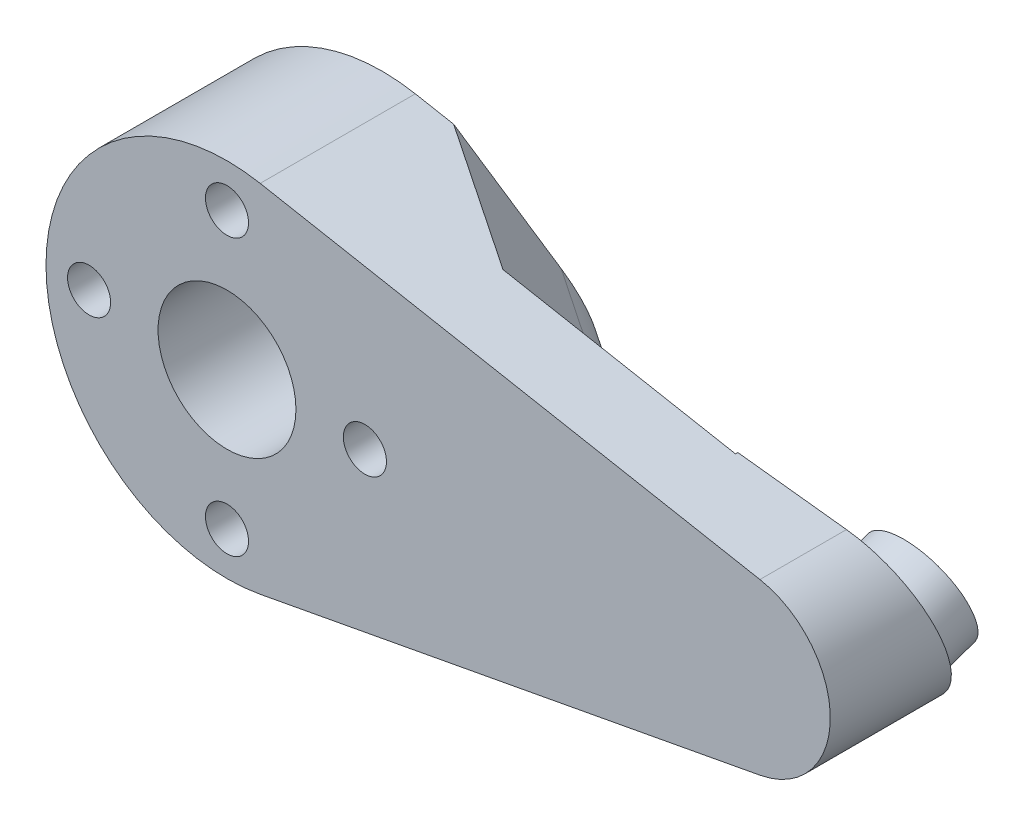
ISO-10303-21;
HEADER;
FILE_DESCRIPTION(('STEP AP214'),'2;1');
FILE_NAME('part.step','',(''),(''),'','','');
FILE_SCHEMA(('AUTOMOTIVE_DESIGN { 1 0 10303 214 1 1 1 1 }'));
ENDSEC;
DATA;
#1=APPLICATION_CONTEXT('core data for automotive mechanical design processes');
#2=APPLICATION_PROTOCOL_DEFINITION('international standard','automotive_design',2000,#1);
#3=PRODUCT_CONTEXT('',#1,'mechanical');
#4=PRODUCT('Part','Part','',(#3));
#5=PRODUCT_RELATED_PRODUCT_CATEGORY('part','',(#4));
#6=PRODUCT_DEFINITION_FORMATION('','',#4);
#7=PRODUCT_DEFINITION_CONTEXT('part definition',#1,'design');
#8=PRODUCT_DEFINITION('design','',#6,#7);
#9=PRODUCT_DEFINITION_SHAPE('','',#8);
#10=(LENGTH_UNIT() NAMED_UNIT(*) SI_UNIT(.MILLI.,.METRE.));
#11=(NAMED_UNIT(*) PLANE_ANGLE_UNIT() SI_UNIT($,.RADIAN.));
#12=(NAMED_UNIT(*) SI_UNIT($,.STERADIAN.) SOLID_ANGLE_UNIT());
#13=UNCERTAINTY_MEASURE_WITH_UNIT(LENGTH_MEASURE(1.E-05),#10,'distance_accuracy_value','');
#14=(GEOMETRIC_REPRESENTATION_CONTEXT(3) GLOBAL_UNCERTAINTY_ASSIGNED_CONTEXT((#13)) GLOBAL_UNIT_ASSIGNED_CONTEXT((#10,
#11,#12)) REPRESENTATION_CONTEXT('',''));
#15=CARTESIAN_POINT('',(0.,0.,0.));
#16=DIRECTION('',(0.,0.,1.));
#17=DIRECTION('',(1.,0.,0.));
#18=AXIS2_PLACEMENT_3D('',#15,#16,#17);
#19=CARTESIAN_POINT('',(30.9166666666667,-4.91525403435288,10.));
#20=DIRECTION('',(-0.183333333333333,0.983050806870575,0.));
#21=DIRECTION('',(-0.983050806870575,-0.183333333333333,0.));
#22=AXIS2_PLACEMENT_3D('',#19,#20,#21);
#23=PLANE('',#22);
#24=DIRECTION('',(-0.983050806870575,-0.183333333333333,0.));
#25=VECTOR('',#24,1.);
#26=CARTESIAN_POINT('',(30.9166666666667,-4.91525403435288,0.999999999999999));
#27=LINE('',#26,#25);
#28=CARTESIAN_POINT('',(5.0005796275775,-9.74845552366161,1.));
#29=VERTEX_POINT('',#28);
#30=CARTESIAN_POINT('',(1.925,-10.322033472141,0.999999999999999));
#31=VERTEX_POINT('',#30);
#32=EDGE_CURVE('E280',#29,#31,#27,.T.);
#33=ORIENTED_EDGE('',*,*,#32,.F.);
#34=DIRECTION('',(0.84267893969236,0.157154785758636,0.514970463145331));
#35=VECTOR('',#34,1.);
#36=CARTESIAN_POINT('',(17.9750314827619,-7.32879471858486,8.92883168927933));
#37=LINE('',#36,#35);
#38=CARTESIAN_POINT('',(12.3642159912139,-8.37517960489443,5.5));
#39=VERTEX_POINT('',#38);
#40=EDGE_CURVE('E145',#29,#39,#37,.T.);
#41=ORIENTED_EDGE('',*,*,#40,.T.);
#42=DIRECTION('',(-0.983050806870575,-0.183333333333333,0.));
#43=VECTOR('',#42,1.);
#44=CARTESIAN_POINT('',(19.3602247485707,-7.07046412472671,5.5));
#45=LINE('',#44,#43);
#46=CARTESIAN_POINT('',(29.7333333333333,-5.13593890936464,5.5));
#47=VERTEX_POINT('',#46);
#48=EDGE_CURVE('E232',#47,#39,#45,.T.);
#49=ORIENTED_EDGE('',*,*,#48,.F.);
#50=DIRECTION('',(0.,0.,1.));
#51=VECTOR('',#50,1.);
#52=CARTESIAN_POINT('',(29.7333333333333,-5.13593890936464,1.17631364869091));
#53=LINE('',#52,#51);
#54=CARTESIAN_POINT('',(29.7333333333333,-5.13593890936464,1.48337060694694));
#55=VERTEX_POINT('',#54);
#56=EDGE_CURVE('E177',#47,#55,#53,.F.);
#57=ORIENTED_EDGE('',*,*,#56,.T.);
#58=DIRECTION('',(-0.981057934819953,-0.182961674133835,-0.0636423940856517));
#59=VECTOR('',#58,1.);
#60=CARTESIAN_POINT('',(31.443625478253,-4.81697924043349,1.5943192908374));
#61=LINE('',#60,#59);
#62=CARTESIAN_POINT('',(30.6041422781402,-4.97353803910225,1.53986101803451));
#63=VERTEX_POINT('',#62);
#64=EDGE_CURVE('E240',#63,#55,#61,.T.);
#65=ORIENTED_EDGE('',*,*,#64,.F.);
#66=CARTESIAN_POINT('',(30.9166666666667,-4.91525403435287,1.56013484651094));
#67=VERTEX_POINT('',#66);
#68=EDGE_CURVE('E237',#67,#63,#61,.T.);
#69=ORIENTED_EDGE('',*,*,#68,.F.);
#70=DIRECTION('',(0.,0.,-1.));
#71=VECTOR('',#70,1.);
#72=CARTESIAN_POINT('',(30.9166666666667,-4.91525403435287,10.));
#73=LINE('',#72,#71);
#74=CARTESIAN_POINT('',(30.9166666666667,-4.91525403435287,10.));
#75=VERTEX_POINT('',#74);
#76=EDGE_CURVE('E194',#75,#67,#73,.T.);
#77=ORIENTED_EDGE('',*,*,#76,.F.);
#78=DIRECTION('',(0.983050806870575,0.183333333333333,0.));
#79=VECTOR('',#78,1.);
#80=CARTESIAN_POINT('',(30.9166666666667,-4.91525403435288,10.));
#81=LINE('',#80,#79);
#82=CARTESIAN_POINT('',(1.925,-10.322033472141,10.));
#83=VERTEX_POINT('',#82);
#84=EDGE_CURVE('E207',#83,#75,#81,.T.);
#85=ORIENTED_EDGE('',*,*,#84,.F.);
#86=DIRECTION('',(0.,0.,-1.));
#87=VECTOR('',#86,1.);
#88=CARTESIAN_POINT('',(1.925,-10.322033472141,10.));
#89=LINE('',#88,#87);
#90=EDGE_CURVE('E191',#83,#31,#89,.T.);
#91=ORIENTED_EDGE('',*,*,#90,.T.);
#92=EDGE_LOOP('',(#33,#41,#49,#57,#65,#69,#77,#85,#91));
#93=FACE_BOUND('',#92,.T.);
#94=ADVANCED_FACE('F40',(#93),#23,.F.);
#95=CARTESIAN_POINT('',(1.925,10.322033472141,10.));
#96=DIRECTION('',(-0.183333333333333,-0.983050806870575,0.));
#97=DIRECTION('',(0.983050806870575,-0.183333333333333,0.));
#98=AXIS2_PLACEMENT_3D('',#95,#96,#97);
#99=PLANE('',#98);
#100=DIRECTION('',(0.983050806870575,-0.183333333333333,0.));
#101=VECTOR('',#100,1.);
#102=CARTESIAN_POINT('',(1.925,10.322033472141,0.999999999999999));
#103=LINE('',#102,#101);
#104=CARTESIAN_POINT('',(1.925,10.322033472141,0.999999999999999));
#105=VERTEX_POINT('',#104);
#106=CARTESIAN_POINT('',(4.1504690040238,9.90699627580677,1.));
#107=VERTEX_POINT('',#106);
#108=EDGE_CURVE('E270',#105,#107,#103,.T.);
#109=ORIENTED_EDGE('',*,*,#108,.F.);
#110=DIRECTION('',(0.,0.,-1.));
#111=VECTOR('',#110,1.);
#112=CARTESIAN_POINT('',(1.925,10.322033472141,10.));
#113=LINE('',#112,#111);
#114=CARTESIAN_POINT('',(1.925,10.322033472141,10.));
#115=VERTEX_POINT('',#114);
#116=EDGE_CURVE('E200',#115,#105,#113,.T.);
#117=ORIENTED_EDGE('',*,*,#116,.F.);
#118=DIRECTION('',(-0.983050806870575,0.183333333333333,0.));
#119=VECTOR('',#118,1.);
#120=CARTESIAN_POINT('',(1.925,10.322033472141,10.));
#121=LINE('',#120,#119);
#122=CARTESIAN_POINT('',(30.9166666666667,4.91525403435287,10.));
#123=VERTEX_POINT('',#122);
#124=EDGE_CURVE('E203',#123,#115,#121,.T.);
#125=ORIENTED_EDGE('',*,*,#124,.F.);
#126=DIRECTION('',(0.,0.,-1.));
#127=VECTOR('',#126,1.);
#128=CARTESIAN_POINT('',(30.9166666666667,4.91525403435287,10.));
#129=LINE('',#128,#127);
#130=CARTESIAN_POINT('',(30.9166666666667,4.91525403435287,4.97963279072575));
#131=VERTEX_POINT('',#130);
#132=EDGE_CURVE('E197',#123,#131,#129,.T.);
#133=ORIENTED_EDGE('',*,*,#132,.T.);
#134=DIRECTION('',(0.981057934819953,-0.182961674133835,-0.0636423940856517));
#135=VECTOR('',#134,1.);
#136=CARTESIAN_POINT('',(1.72897047901362,10.3585918527079,6.8730733280247));
#137=LINE('',#136,#135);
#138=CARTESIAN_POINT('',(25.,6.01867840941168,5.36345398854578));
#139=VERTEX_POINT('',#138);
#140=EDGE_CURVE('E241',#139,#131,#137,.T.);
#141=ORIENTED_EDGE('',*,*,#140,.F.);
#142=DIRECTION('',(0.,0.,1.));
#143=VECTOR('',#142,1.);
#144=CARTESIAN_POINT('',(25.,6.01867840941168,5.5));
#145=LINE('',#144,#143);
#146=CARTESIAN_POINT('',(25.,6.01867840941168,5.5));
#147=VERTEX_POINT('',#146);
#148=EDGE_CURVE('E230',#139,#147,#145,.T.);
#149=ORIENTED_EDGE('',*,*,#148,.T.);
#150=DIRECTION('',(-0.983050806870575,0.183333333333333,0.));
#151=VECTOR('',#150,1.);
#152=CARTESIAN_POINT('',(19.3602247485707,7.0704641247267,5.5));
#153=LINE('',#152,#151);
#154=CARTESIAN_POINT('',(11.5141053676602,8.5337203570396,5.5));
#155=VERTEX_POINT('',#154);
#156=EDGE_CURVE('E227',#147,#155,#153,.T.);
#157=ORIENTED_EDGE('',*,*,#156,.T.);
#158=DIRECTION('',(-0.84267893969236,0.157154785758636,-0.514970463145331));
#159=VECTOR('',#158,1.);
#160=CARTESIAN_POINT('',(8.74958675476994,9.04928721159174,3.81057195878931));
#161=LINE('',#160,#159);
#162=EDGE_CURVE('E188',#155,#107,#161,.T.);
#163=ORIENTED_EDGE('',*,*,#162,.T.);
#164=EDGE_LOOP('',(#109,#117,#125,#133,#141,#149,#157,#163));
#165=FACE_BOUND('',#164,.T.);
#166=ADVANCED_FACE('F292',(#165),#99,.F.);
#167=CARTESIAN_POINT('',(0.,0.,10.));
#168=DIRECTION('',(0.,0.,-1.));
#169=DIRECTION('',(-1.,0.,0.));
#170=AXIS2_PLACEMENT_3D('',#167,#168,#169);
#171=CYLINDRICAL_SURFACE('',#170,10.5);
#172=CARTESIAN_POINT('',(0.,0.,0.999999999999999));
#173=DIRECTION('',(0.,0.,-1.));
#174=DIRECTION('',(-1.,0.,0.));
#175=AXIS2_PLACEMENT_3D('',#172,#173,#174);
#176=CIRCLE('',#175,10.5);
#177=EDGE_CURVE('E272',#31,#105,#176,.T.);
#178=ORIENTED_EDGE('',*,*,#177,.F.);
#179=ORIENTED_EDGE('',*,*,#90,.F.);
#180=CARTESIAN_POINT('',(0.,0.,10.));
#181=DIRECTION('',(0.,0.,1.));
#182=DIRECTION('',(1.,0.,0.));
#183=AXIS2_PLACEMENT_3D('',#180,#181,#182);
#184=CIRCLE('',#183,10.5);
#185=EDGE_CURVE('E209',#115,#83,#184,.T.);
#186=ORIENTED_EDGE('',*,*,#185,.F.);
#187=ORIENTED_EDGE('',*,*,#116,.T.);
#188=EDGE_LOOP('',(#178,#179,#186,#187));
#189=FACE_BOUND('',#188,.T.);
#190=ADVANCED_FACE('F311',(#189),#171,.T.);
#191=CARTESIAN_POINT('',(0.,0.,-0.000999999999999265));
#192=DIRECTION('',(0.,0.,1.));
#193=DIRECTION('',(1.,0.,0.));
#194=AXIS2_PLACEMENT_3D('',#191,#192,#193);
#195=CYLINDRICAL_SURFACE('',#194,4.);
#196=CARTESIAN_POINT('',(0.,0.,10.));
#197=DIRECTION('',(0.,0.,1.));
#198=DIRECTION('',(1.,0.,0.));
#199=AXIS2_PLACEMENT_3D('',#196,#197,#198);
#200=CIRCLE('',#199,4.);
#201=CARTESIAN_POINT('',(4.,0.,10.));
#202=VERTEX_POINT('',#201);
#203=EDGE_CURVE('E212',#202,#202,#200,.T.);
#204=ORIENTED_EDGE('',*,*,#203,.T.);
#205=EDGE_LOOP('',(#204));
#206=FACE_BOUND('',#205,.T.);
#207=CARTESIAN_POINT('',(0.,0.,1.));
#208=DIRECTION('',(0.,0.,-1.));
#209=DIRECTION('',(-1.,0.,0.));
#210=AXIS2_PLACEMENT_3D('',#207,#208,#209);
#211=CIRCLE('',#210,4.);
#212=CARTESIAN_POINT('',(-4.,0.,1.));
#213=VERTEX_POINT('',#212);
#214=EDGE_CURVE('E255',#213,#213,#211,.F.);
#215=ORIENTED_EDGE('',*,*,#214,.F.);
#216=EDGE_LOOP('',(#215));
#217=FACE_BOUND('',#216,.T.);
#218=ADVANCED_FACE('F354',(#206,#217),#195,.F.);
#219=CARTESIAN_POINT('',(-8.,0.,-0.000999999999999265));
#220=DIRECTION('',(0.,0.,1.));
#221=DIRECTION('',(1.,0.,0.));
#222=AXIS2_PLACEMENT_3D('',#219,#220,#221);
#223=CYLINDRICAL_SURFACE('',#222,1.25000000000008);
#224=CARTESIAN_POINT('',(-8.,0.,10.));
#225=DIRECTION('',(0.,0.,1.));
#226=DIRECTION('',(1.,0.,0.));
#227=AXIS2_PLACEMENT_3D('',#224,#225,#226);
#228=CIRCLE('',#227,1.25000000000008);
#229=CARTESIAN_POINT('',(-6.74999999999992,0.,10.));
#230=VERTEX_POINT('',#229);
#231=EDGE_CURVE('E172',#230,#230,#228,.T.);
#232=ORIENTED_EDGE('',*,*,#231,.T.);
#233=EDGE_LOOP('',(#232));
#234=FACE_BOUND('',#233,.T.);
#235=CARTESIAN_POINT('',(-8.,0.,1.));
#236=DIRECTION('',(0.,0.,-1.));
#237=DIRECTION('',(-1.,0.,0.));
#238=AXIS2_PLACEMENT_3D('',#235,#236,#237);
#239=CIRCLE('',#238,1.25000000000008);
#240=CARTESIAN_POINT('',(-9.25000000000008,0.,1.));
#241=VERTEX_POINT('',#240);
#242=EDGE_CURVE('E258',#241,#241,#239,.F.);
#243=ORIENTED_EDGE('',*,*,#242,.F.);
#244=EDGE_LOOP('',(#243));
#245=FACE_BOUND('',#244,.T.);
#246=ADVANCED_FACE('F391',(#234,#245),#223,.F.);
#247=CARTESIAN_POINT('',(0.,-8.,-0.000999999999999265));
#248=DIRECTION('',(0.,0.,1.));
#249=DIRECTION('',(1.,0.,0.));
#250=AXIS2_PLACEMENT_3D('',#247,#248,#249);
#251=CYLINDRICAL_SURFACE('',#250,1.25000000000005);
#252=CARTESIAN_POINT('',(0.,-8.,10.));
#253=DIRECTION('',(0.,0.,1.));
#254=DIRECTION('',(1.,0.,0.));
#255=AXIS2_PLACEMENT_3D('',#252,#253,#254);
#256=CIRCLE('',#255,1.25000000000005);
#257=CARTESIAN_POINT('',(1.25000000000006,-8.,10.));
#258=VERTEX_POINT('',#257);
#259=EDGE_CURVE('E219',#258,#258,#256,.T.);
#260=ORIENTED_EDGE('',*,*,#259,.T.);
#261=EDGE_LOOP('',(#260));
#262=FACE_BOUND('',#261,.T.);
#263=CARTESIAN_POINT('',(0.,-8.,1.));
#264=DIRECTION('',(0.,0.,-1.));
#265=DIRECTION('',(-1.,0.,0.));
#266=AXIS2_PLACEMENT_3D('',#263,#264,#265);
#267=CIRCLE('',#266,1.25000000000005);
#268=CARTESIAN_POINT('',(-1.25000000000005,-8.,1.));
#269=VERTEX_POINT('',#268);
#270=EDGE_CURVE('E261',#269,#269,#267,.F.);
#271=ORIENTED_EDGE('',*,*,#270,.F.);
#272=EDGE_LOOP('',(#271));
#273=FACE_BOUND('',#272,.T.);
#274=ADVANCED_FACE('F387',(#262,#273),#251,.F.);
#275=CARTESIAN_POINT('',(8.,0.,-0.000999999999999265));
#276=DIRECTION('',(0.,0.,1.));
#277=DIRECTION('',(1.,0.,0.));
#278=AXIS2_PLACEMENT_3D('',#275,#276,#277);
#279=CYLINDRICAL_SURFACE('',#278,1.25000000000003);
#280=CARTESIAN_POINT('',(8.,0.,10.));
#281=DIRECTION('',(0.,0.,1.));
#282=DIRECTION('',(1.,0.,0.));
#283=AXIS2_PLACEMENT_3D('',#280,#281,#282);
#284=CIRCLE('',#283,1.25000000000003);
#285=CARTESIAN_POINT('',(9.25000000000003,0.,10.));
#286=VERTEX_POINT('',#285);
#287=EDGE_CURVE('E216',#286,#286,#284,.T.);
#288=ORIENTED_EDGE('',*,*,#287,.T.);
#289=EDGE_LOOP('',(#288));
#290=FACE_BOUND('',#289,.T.);
#291=CARTESIAN_POINT('',(8.,0.,1.));
#292=DIRECTION('',(0.,0.,-1.));
#293=DIRECTION('',(-1.,0.,0.));
#294=AXIS2_PLACEMENT_3D('',#291,#292,#293);
#295=CIRCLE('',#294,1.25000000000003);
#296=CARTESIAN_POINT('',(6.74999999999997,0.,1.));
#297=VERTEX_POINT('',#296);
#298=EDGE_CURVE('E264',#297,#297,#295,.F.);
#299=ORIENTED_EDGE('',*,*,#298,.F.);
#300=EDGE_LOOP('',(#299));
#301=FACE_BOUND('',#300,.T.);
#302=ADVANCED_FACE('F390',(#290,#301),#279,.F.);
#303=CARTESIAN_POINT('',(0.,8.,-0.000999999999999265));
#304=DIRECTION('',(0.,0.,1.));
#305=DIRECTION('',(1.,0.,0.));
#306=AXIS2_PLACEMENT_3D('',#303,#304,#305);
#307=CYLINDRICAL_SURFACE('',#306,1.25);
#308=CARTESIAN_POINT('',(0.,8.,10.));
#309=DIRECTION('',(0.,0.,1.));
#310=DIRECTION('',(1.,0.,0.));
#311=AXIS2_PLACEMENT_3D('',#308,#309,#310);
#312=CIRCLE('',#311,1.25);
#313=CARTESIAN_POINT('',(1.25,8.,10.));
#314=VERTEX_POINT('',#313);
#315=EDGE_CURVE('E215',#314,#314,#312,.T.);
#316=ORIENTED_EDGE('',*,*,#315,.T.);
#317=EDGE_LOOP('',(#316));
#318=FACE_BOUND('',#317,.T.);
#319=CARTESIAN_POINT('',(0.,8.,1.));
#320=DIRECTION('',(0.,0.,-1.));
#321=DIRECTION('',(-1.,0.,0.));
#322=AXIS2_PLACEMENT_3D('',#319,#320,#321);
#323=CIRCLE('',#322,1.25);
#324=CARTESIAN_POINT('',(-1.25,8.,1.));
#325=VERTEX_POINT('',#324);
#326=EDGE_CURVE('E267',#325,#325,#323,.F.);
#327=ORIENTED_EDGE('',*,*,#326,.F.);
#328=EDGE_LOOP('',(#327));
#329=FACE_BOUND('',#328,.T.);
#330=ADVANCED_FACE('F386',(#318,#329),#307,.F.);
#331=CARTESIAN_POINT('',(11.,10.501,0.));
#332=DIRECTION('',(0.521450009453975,0.,-0.853281833651959));
#333=DIRECTION('',(-0.853281833651959,0.,-0.521450009453975));
#334=AXIS2_PLACEMENT_3D('',#331,#332,#333);
#335=PLANE('',#334);
#336=DIRECTION('',(-0.84267893969236,-0.157154785758636,-0.514970463145331));
#337=VECTOR('',#336,1.);
#338=CARTESIAN_POINT('',(12.7447194957763,-2.34817203868942,1.06621746964109));
#339=LINE('',#338,#337);
#340=CARTESIAN_POINT('',(20.,-0.995103865802207,5.5));
#341=VERTEX_POINT('',#340);
#342=CARTESIAN_POINT('',(12.6363636363636,-2.36837978456938,1.));
#343=VERTEX_POINT('',#342);
#344=EDGE_CURVE('E169',#341,#343,#339,.T.);
#345=ORIENTED_EDGE('',*,*,#344,.T.);
#346=DIRECTION('',(0.,1.,0.));
#347=VECTOR('',#346,1.);
#348=CARTESIAN_POINT('',(12.6363636363636,10.501,1.));
#349=LINE('',#348,#347);
#350=CARTESIAN_POINT('',(12.6363636363636,2.59639477688537,1.));
#351=VERTEX_POINT('',#350);
#352=EDGE_CURVE('E55',#343,#351,#349,.T.);
#353=ORIENTED_EDGE('',*,*,#352,.T.);
#354=DIRECTION('',(0.84267893969236,-0.157154785758636,0.514970463145331));
#355=VECTOR('',#354,1.);
#356=CARTESIAN_POINT('',(9.99359930076026,3.08925515752326,-0.615022649535395));
#357=LINE('',#356,#355);
#358=CARTESIAN_POINT('',(20.,1.2231188581182,5.5));
#359=VERTEX_POINT('',#358);
#360=EDGE_CURVE('E155',#351,#359,#357,.T.);
#361=ORIENTED_EDGE('',*,*,#360,.T.);
#362=DIRECTION('',(0.,-1.,0.));
#363=VECTOR('',#362,1.);
#364=CARTESIAN_POINT('',(20.,10.501,5.5));
#365=LINE('',#364,#363);
#366=EDGE_CURVE('E164',#359,#341,#365,.T.);
#367=ORIENTED_EDGE('',*,*,#366,.T.);
#368=EDGE_LOOP('',(#345,#353,#361,#367));
#369=FACE_BOUND('',#368,.T.);
#370=ADVANCED_FACE('F168',(#369),#335,.T.);
#371=CARTESIAN_POINT('',(6.42077518788431,9.48359720277267,2.38740933458143));
#372=DIRECTION('',(0.463541964703871,0.698320260809162,-0.545415126579653));
#373=DIRECTION('',(0.84267893969236,-0.157154785758636,0.514970463145331));
#374=AXIS2_PLACEMENT_3D('',#371,#372,#373);
#375=PLANE('',#374);
#376=DIRECTION('',(0.84267893969236,-0.157154785758636,0.514970463145331));
#377=VECTOR('',#376,1.);
#378=CARTESIAN_POINT('',(7.68098723836055,6.27062700538242,-0.655265749990183));
#379=LINE('',#378,#377);
#380=CARTESIAN_POINT('',(17.753240283799,4.392209621366,5.5));
#381=VERTEX_POINT('',#380);
#382=CARTESIAN_POINT('',(10.3896039201627,5.76548554013317,1.));
#383=VERTEX_POINT('',#382);
#384=EDGE_CURVE('E149',#381,#383,#379,.F.);
#385=ORIENTED_EDGE('',*,*,#384,.T.);
#386=DIRECTION('',(-0.833152636859098,0.553043111967532,0.));
#387=VECTOR('',#386,1.);
#388=CARTESIAN_POINT('',(5.9214761734652,8.73140938695398,1.));
#389=LINE('',#388,#387);
#390=EDGE_CURVE('E274',#383,#107,#389,.T.);
#391=ORIENTED_EDGE('',*,*,#390,.T.);
#392=ORIENTED_EDGE('',*,*,#162,.F.);
#393=DIRECTION('',(-0.833152636859098,0.553043111967532,0.));
#394=VECTOR('',#393,1.);
#395=CARTESIAN_POINT('',(7.54093015066065,11.1710968582836,5.5));
#396=LINE('',#395,#394);
#397=EDGE_CURVE('E185',#381,#155,#396,.T.);
#398=ORIENTED_EDGE('',*,*,#397,.F.);
#399=EDGE_LOOP('',(#385,#391,#392,#398));
#400=FACE_BOUND('',#399,.T.);
#401=ADVANCED_FACE('F289',(#400),#375,.T.);
#402=CARTESIAN_POINT('',(12.9373779362334,-3.76702558628356,1.18395318325376));
#403=DIRECTION('',(0.48760348577462,-0.628363055578937,-0.606137534759184));
#404=DIRECTION('',(0.84267893969236,0.157154785758636,0.514970463145331));
#405=AXIS2_PLACEMENT_3D('',#402,#403,#404);
#406=PLANE('',#405);
#407=ORIENTED_EDGE('',*,*,#40,.F.);
#408=DIRECTION('',(0.790036178705909,0.613060222438028,0.));
#409=VECTOR('',#408,1.);
#410=CARTESIAN_POINT('',(12.8514334616035,-3.65627097877123,1.));
#411=LINE('',#410,#409);
#412=CARTESIAN_POINT('',(10.8833057670753,-5.18351850833406,1.));
#413=VERTEX_POINT('',#412);
#414=EDGE_CURVE('E138',#29,#413,#411,.T.);
#415=ORIENTED_EDGE('',*,*,#414,.T.);
#416=DIRECTION('',(-0.84267893969236,-0.157154785758636,-0.514970463145331));
#417=VECTOR('',#416,1.);
#418=CARTESIAN_POINT('',(12.6093334010589,-4.86162426100517,2.05479466521219));
#419=LINE('',#418,#417);
#420=CARTESIAN_POINT('',(18.2469421307117,-3.81024258956688,5.5));
#421=VERTEX_POINT('',#420);
#422=EDGE_CURVE('E62',#413,#421,#419,.F.);
#423=ORIENTED_EDGE('',*,*,#422,.T.);
#424=DIRECTION('',(0.790036178705909,0.613060222438028,0.));
#425=VECTOR('',#424,1.);
#426=CARTESIAN_POINT('',(14.9538713155945,-6.36563281198277,5.5));
#427=LINE('',#426,#425);
#428=EDGE_CURVE('E166',#39,#421,#427,.T.);
#429=ORIENTED_EDGE('',*,*,#428,.F.);
#430=EDGE_LOOP('',(#407,#415,#423,#429));
#431=FACE_BOUND('',#430,.T.);
#432=ADVANCED_FACE('F144',(#431),#406,.T.);
#433=CARTESIAN_POINT('',(7.90779926294436,3.08925515752326,2.79810468507244));
#434=DIRECTION('',(0.84267893969236,-0.157154785758636,0.514970463145331));
#435=DIRECTION('',(0.521450009453975,0.,-0.853281833651959));
#436=AXIS2_PLACEMENT_3D('',#433,#434,#435);
#437=CYLINDRICAL_SURFACE('',#436,4.);
#438=ORIENTED_EDGE('',*,*,#360,.F.);
#439=CARTESIAN_POINT('',(4.96544614191673,3.63798712717491,1.));
#440=DIRECTION('',(0.,0.,-1.));
#441=DIRECTION('',(0.983050806870575,-0.183333333333333,0.));
#442=AXIS2_PLACEMENT_3D('',#439,#440,#441);
#443=ELLIPSE('',#442,7.76743577790625,4.);
#444=EDGE_CURVE('E277',#351,#383,#443,.F.);
#445=ORIENTED_EDGE('',*,*,#444,.T.);
#446=ORIENTED_EDGE('',*,*,#384,.F.);
#447=CARTESIAN_POINT('',(12.3290825055531,2.26471120840774,5.5));
#448=DIRECTION('',(0.,0.,-1.));
#449=DIRECTION('',(0.983050806870575,-0.183333333333333,0.));
#450=AXIS2_PLACEMENT_3D('',#447,#448,#449);
#451=ELLIPSE('',#450,7.76743577790625,4.);
#452=EDGE_CURVE('E152',#359,#381,#451,.F.);
#453=ORIENTED_EDGE('',*,*,#452,.F.);
#454=EDGE_LOOP('',(#438,#445,#446,#453));
#455=FACE_BOUND('',#454,.T.);
#456=ADVANCED_FACE('F283',(#455),#437,.T.);
#457=CARTESIAN_POINT('',(10.6589194579604,-2.34817203868942,4.47934480424892));
#458=DIRECTION('',(-0.84267893969236,-0.157154785758636,-0.514970463145331));
#459=DIRECTION('',(-0.521450009453975,0.,0.853281833651959));
#460=AXIS2_PLACEMENT_3D('',#457,#458,#459);
#461=CYLINDRICAL_SURFACE('',#460,4.);
#462=ORIENTED_EDGE('',*,*,#422,.F.);
#463=CARTESIAN_POINT('',(4.96544614191673,-3.40997213485892,1.));
#464=DIRECTION('',(0.,0.,-1.));
#465=DIRECTION('',(-0.983050806870575,-0.183333333333333,0.));
#466=AXIS2_PLACEMENT_3D('',#463,#464,#465);
#467=ELLIPSE('',#466,7.76743577790625,4.);
#468=EDGE_CURVE('E11',#413,#343,#467,.F.);
#469=ORIENTED_EDGE('',*,*,#468,.T.);
#470=ORIENTED_EDGE('',*,*,#344,.F.);
#471=CARTESIAN_POINT('',(12.3290825055531,-2.03669621609175,5.5));
#472=DIRECTION('',(0.,0.,-1.));
#473=DIRECTION('',(-0.983050806870575,-0.183333333333333,0.));
#474=AXIS2_PLACEMENT_3D('',#471,#472,#473);
#475=ELLIPSE('',#474,7.76743577790625,4.);
#476=EDGE_CURVE('E48',#421,#341,#475,.F.);
#477=ORIENTED_EDGE('',*,*,#476,.F.);
#478=EDGE_LOOP('',(#462,#469,#470,#477));
#479=FACE_BOUND('',#478,.T.);
#480=ADVANCED_FACE('F42',(#479),#461,.T.);
#481=CARTESIAN_POINT('',(0.,-1.01464577898796,2.91694385548454));
#482=DIRECTION('',(0.,0.328536977168796,-0.944491108816166));
#483=DIRECTION('',(0.,0.944491108816166,0.328536977168796));
#484=AXIS2_PLACEMENT_3D('',#481,#482,#483);
#485=PLANE('',#484);
#486=ORIENTED_EDGE('',*,*,#64,.T.);
#487=CARTESIAN_POINT('',(29.,-1.20373568188234,2.85116978463286));
#488=DIRECTION('',(0.,0.328536977168796,-0.944491108816166));
#489=DIRECTION('',(0.,-0.944491108816166,-0.328536977168796));
#490=AXIS2_PLACEMENT_3D('',#487,#488,#489);
#491=ELLIPSE('',#490,4.23508486492122,4.);
#492=CARTESIAN_POINT('',(25.,-1.20373568188234,2.85116978463286));
#493=VERTEX_POINT('',#492);
#494=EDGE_CURVE('E175',#55,#493,#491,.T.);
#495=ORIENTED_EDGE('',*,*,#494,.T.);
#496=DIRECTION('',(0.,0.944491108816165,0.328536977168796));
#497=VECTOR('',#496,1.);
#498=CARTESIAN_POINT('',(25.,-11.2408257767356,-0.640186786703354));
#499=LINE('',#498,#497);
#500=EDGE_CURVE('E245',#493,#139,#499,.T.);
#501=ORIENTED_EDGE('',*,*,#500,.T.);
#502=ORIENTED_EDGE('',*,*,#140,.T.);
#503=CARTESIAN_POINT('',(30.,0.,3.26988381861835));
#504=DIRECTION('',(0.,0.328536977168796,-0.944491108816166));
#505=DIRECTION('',(0.,-0.944491108816166,-0.328536977168796));
#506=AXIS2_PLACEMENT_3D('',#503,#504,#505);
#507=ELLIPSE('',#506,5.29385608115152,5.);
#508=EDGE_CURVE('E243',#131,#67,#507,.T.);
#509=ORIENTED_EDGE('',*,*,#508,.T.);
#510=ORIENTED_EDGE('',*,*,#68,.T.);
#511=CARTESIAN_POINT('',(30.,-2.0837265989503,2.54506890858345));
#512=DIRECTION('',(0.,0.328536977168796,-0.944491108816166));
#513=DIRECTION('',(0.,0.944491108816166,0.328536977168796));
#514=AXIS2_PLACEMENT_3D('',#511,#512,#513);
#515=CIRCLE('',#514,3.11872425121096);
#516=EDGE_CURVE('E248',#63,#63,#515,.T.);
#517=ORIENTED_EDGE('',*,*,#516,.F.);
#518=EDGE_LOOP('',(#486,#495,#501,#502,#509,#510,#517));
#519=FACE_BOUND('',#518,.T.);
#520=ADVANCED_FACE('F324',(#519),#485,.T.);
#521=CARTESIAN_POINT('',(30.,0.,10.));
#522=DIRECTION('',(0.,0.,-1.));
#523=DIRECTION('',(-1.,0.,0.));
#524=AXIS2_PLACEMENT_3D('',#521,#522,#523);
#525=CYLINDRICAL_SURFACE('',#524,5.);
#526=ORIENTED_EDGE('',*,*,#508,.F.);
#527=ORIENTED_EDGE('',*,*,#132,.F.);
#528=CARTESIAN_POINT('',(30.,0.,10.));
#529=DIRECTION('',(0.,0.,1.));
#530=DIRECTION('',(-1.,0.,0.));
#531=AXIS2_PLACEMENT_3D('',#528,#529,#530);
#532=CIRCLE('',#531,5.);
#533=EDGE_CURVE('E205',#75,#123,#532,.T.);
#534=ORIENTED_EDGE('',*,*,#533,.F.);
#535=ORIENTED_EDGE('',*,*,#76,.T.);
#536=EDGE_LOOP('',(#526,#527,#534,#535));
#537=FACE_BOUND('',#536,.T.);
#538=ADVANCED_FACE('F321',(#537),#525,.T.);
#539=CARTESIAN_POINT('',(25.,10.501,5.5));
#540=DIRECTION('',(-1.,0.,0.));
#541=DIRECTION('',(0.,0.,1.));
#542=AXIS2_PLACEMENT_3D('',#539,#540,#541);
#543=PLANE('',#542);
#544=ORIENTED_EDGE('',*,*,#500,.F.);
#545=DIRECTION('',(0.,0.,1.));
#546=VECTOR('',#545,1.);
#547=CARTESIAN_POINT('',(25.,-1.20373568188234,5.5));
#548=LINE('',#547,#546);
#549=CARTESIAN_POINT('',(25.,-1.20373568188234,5.5));
#550=VERTEX_POINT('',#549);
#551=EDGE_CURVE('E181',#493,#550,#548,.T.);
#552=ORIENTED_EDGE('',*,*,#551,.T.);
#553=DIRECTION('',(0.,-1.,0.));
#554=VECTOR('',#553,1.);
#555=CARTESIAN_POINT('',(25.,10.501,5.5));
#556=LINE('',#555,#554);
#557=EDGE_CURVE('E173',#147,#550,#556,.T.);
#558=ORIENTED_EDGE('',*,*,#557,.F.);
#559=ORIENTED_EDGE('',*,*,#148,.F.);
#560=EDGE_LOOP('',(#544,#552,#558,#559));
#561=FACE_BOUND('',#560,.T.);
#562=ADVANCED_FACE('F299',(#561),#543,.T.);
#563=CARTESIAN_POINT('',(0.,0.,10.));
#564=DIRECTION('',(0.,0.,1.));
#565=DIRECTION('',(1.,0.,0.));
#566=AXIS2_PLACEMENT_3D('',#563,#564,#565);
#567=PLANE('',#566);
#568=ORIENTED_EDGE('',*,*,#315,.F.);
#569=EDGE_LOOP('',(#568));
#570=FACE_BOUND('',#569,.T.);
#571=ORIENTED_EDGE('',*,*,#287,.F.);
#572=EDGE_LOOP('',(#571));
#573=FACE_BOUND('',#572,.T.);
#574=ORIENTED_EDGE('',*,*,#259,.F.);
#575=EDGE_LOOP('',(#574));
#576=FACE_BOUND('',#575,.T.);
#577=ORIENTED_EDGE('',*,*,#231,.F.);
#578=EDGE_LOOP('',(#577));
#579=FACE_BOUND('',#578,.T.);
#580=ORIENTED_EDGE('',*,*,#203,.F.);
#581=EDGE_LOOP('',(#580));
#582=FACE_BOUND('',#581,.T.);
#583=ORIENTED_EDGE('',*,*,#185,.T.);
#584=ORIENTED_EDGE('',*,*,#84,.T.);
#585=ORIENTED_EDGE('',*,*,#533,.T.);
#586=ORIENTED_EDGE('',*,*,#124,.T.);
#587=EDGE_LOOP('',(#583,#584,#585,#586));
#588=FACE_BOUND('',#587,.T.);
#589=ADVANCED_FACE('F316',(#570,#573,#576,#579,#582,#588),#567,.T.);
#590=CARTESIAN_POINT('',(20.,10.501,5.5));
#591=DIRECTION('',(0.,0.,-1.));
#592=DIRECTION('',(-1.,0.,0.));
#593=AXIS2_PLACEMENT_3D('',#590,#591,#592);
#594=PLANE('',#593);
#595=ORIENTED_EDGE('',*,*,#557,.T.);
#596=CARTESIAN_POINT('',(29.,-1.20373568188234,5.5));
#597=DIRECTION('',(0.,0.,-1.));
#598=DIRECTION('',(-1.,0.,0.));
#599=AXIS2_PLACEMENT_3D('',#596,#597,#598);
#600=CIRCLE('',#599,4.);
#601=EDGE_CURVE('E148',#550,#47,#600,.F.);
#602=ORIENTED_EDGE('',*,*,#601,.T.);
#603=ORIENTED_EDGE('',*,*,#48,.T.);
#604=ORIENTED_EDGE('',*,*,#428,.T.);
#605=ORIENTED_EDGE('',*,*,#476,.T.);
#606=ORIENTED_EDGE('',*,*,#366,.F.);
#607=ORIENTED_EDGE('',*,*,#452,.T.);
#608=ORIENTED_EDGE('',*,*,#397,.T.);
#609=ORIENTED_EDGE('',*,*,#156,.F.);
#610=EDGE_LOOP('',(#595,#602,#603,#604,#605,#606,#607,#608,#609));
#611=FACE_BOUND('',#610,.T.);
#612=ADVANCED_FACE('F163',(#611),#594,.T.);
#613=CARTESIAN_POINT('',(30.,-1.09811566744391,-0.288404417865043));
#614=DIRECTION('',(0.,0.328536977168796,-0.944491108816166));
#615=DIRECTION('',(0.,0.944491108816166,0.328536977168796));
#616=AXIS2_PLACEMENT_3D('',#613,#614,#615);
#617=PLANE('',#616);
#618=CARTESIAN_POINT('',(30.,-1.09811566744391,-0.288404417865043));
#619=DIRECTION('',(0.,0.328536977168796,-0.944491108816166));
#620=DIRECTION('',(0.,0.944491108816166,0.328536977168796));
#621=AXIS2_PLACEMENT_3D('',#618,#619,#620);
#622=CIRCLE('',#621,3.11872425121096);
#623=CARTESIAN_POINT('',(30.,1.8474916586742,0.736211820250824));
#624=VERTEX_POINT('',#623);
#625=EDGE_CURVE('E247',#624,#624,#622,.T.);
#626=ORIENTED_EDGE('',*,*,#625,.T.);
#627=EDGE_LOOP('',(#626));
#628=FACE_BOUND('',#627,.T.);
#629=CARTESIAN_POINT('',(30.,-1.09811566744391,-0.288404417865042));
#630=DIRECTION('',(0.,0.328536977168796,-0.944491108816166));
#631=DIRECTION('',(0.,0.944491108816166,0.328536977168796));
#632=AXIS2_PLACEMENT_3D('',#629,#630,#631);
#633=CIRCLE('',#632,1.25);
#634=CARTESIAN_POINT('',(30.,0.0824982185763014,0.122266803595953));
#635=VERTEX_POINT('',#634);
#636=EDGE_CURVE('E250',#635,#635,#633,.T.);
#637=ORIENTED_EDGE('',*,*,#636,.F.);
#638=EDGE_LOOP('',(#637));
#639=FACE_BOUND('',#638,.T.);
#640=ADVANCED_FACE('F330',(#628,#639),#617,.T.);
#641=CARTESIAN_POINT('',(30.,-1.09811566744391,-0.288404417865043));
#642=DIRECTION('',(0.,-0.328536977168796,0.944491108816165));
#643=DIRECTION('',(0.,-0.944491108816166,-0.328536977168796));
#644=AXIS2_PLACEMENT_3D('',#641,#642,#643);
#645=CYLINDRICAL_SURFACE('',#644,3.11872425121096);
#646=ORIENTED_EDGE('',*,*,#625,.F.);
#647=EDGE_LOOP('',(#646));
#648=FACE_BOUND('',#647,.T.);
#649=ORIENTED_EDGE('',*,*,#516,.T.);
#650=EDGE_LOOP('',(#649));
#651=FACE_BOUND('',#650,.T.);
#652=ADVANCED_FACE('F327',(#648,#651),#645,.T.);
#653=CARTESIAN_POINT('',(30.,-3.06933753045668,5.37854223503195));
#654=DIRECTION('',(0.,0.328536977168796,-0.944491108816166));
#655=DIRECTION('',(0.,0.944491108816166,0.328536977168796));
#656=AXIS2_PLACEMENT_3D('',#653,#654,#655);
#657=PLANE('',#656);
#658=CARTESIAN_POINT('',(30.,-3.06933753045668,5.37854223503195));
#659=DIRECTION('',(0.,0.328536977168796,-0.944491108816166));
#660=DIRECTION('',(0.,0.944491108816166,0.328536977168796));
#661=AXIS2_PLACEMENT_3D('',#658,#659,#660);
#662=CIRCLE('',#661,1.25);
#663=CARTESIAN_POINT('',(30.,-1.88872364443647,5.78921345649295));
#664=VERTEX_POINT('',#663);
#665=EDGE_CURVE('E234',#664,#664,#662,.T.);
#666=ORIENTED_EDGE('',*,*,#665,.T.);
#667=EDGE_LOOP('',(#666));
#668=FACE_BOUND('',#667,.T.);
#669=ADVANCED_FACE('F329',(#668),#657,.T.);
#670=CARTESIAN_POINT('',(30.,-3.06933753045668,5.37854223503195));
#671=DIRECTION('',(0.,0.328536977168796,-0.944491108816165));
#672=DIRECTION('',(0.,0.944491108816166,0.328536977168796));
#673=AXIS2_PLACEMENT_3D('',#670,#671,#672);
#674=CYLINDRICAL_SURFACE('',#673,1.25);
#675=CARTESIAN_POINT('',(30.,-1.88872364443647,5.78921345649295));
#676=CARTESIAN_POINT('',(30.,-1.86819008336342,5.73018276219194));
#677=CARTESIAN_POINT('',(30.,-1.84765652229038,5.67115206789093));
#678=CARTESIAN_POINT('',(30.,-1.80658940014428,5.5530906792889));
#679=CARTESIAN_POINT('',(30.,-1.78605583907123,5.49405998498789));
#680=CARTESIAN_POINT('',(30.,-1.74498871692513,5.37599859638587));
#681=CARTESIAN_POINT('',(30.,-1.72445515585208,5.31696790208486));
#682=CARTESIAN_POINT('',(30.,-1.68338803370598,5.19890651348284));
#683=CARTESIAN_POINT('',(30.,-1.66285447263293,5.13987581918183));
#684=CARTESIAN_POINT('',(30.,-1.62178735048683,5.02181443057981));
#685=CARTESIAN_POINT('',(30.,-1.60125378941378,4.9627837362788));
#686=CARTESIAN_POINT('',(30.,-1.56018666726768,4.84472234767678));
#687=CARTESIAN_POINT('',(30.,-1.53965310619463,4.78569165337577));
#688=CARTESIAN_POINT('',(30.,-1.49858598404853,4.66763026477375));
#689=CARTESIAN_POINT('',(30.,-1.47805242297548,4.60859957047274));
#690=CARTESIAN_POINT('',(30.,-1.43698530082938,4.49053818187072));
#691=CARTESIAN_POINT('',(30.,-1.41645173975633,4.43150748756971));
#692=CARTESIAN_POINT('',(30.,-1.37538461761023,4.31344609896769));
#693=CARTESIAN_POINT('',(30.,-1.35485105653718,4.25441540466668));
#694=CARTESIAN_POINT('',(30.,-1.31378393439108,4.13635401606466));
#695=CARTESIAN_POINT('',(30.,-1.29325037331803,4.07732332176365));
#696=CARTESIAN_POINT('',(30.,-1.25218325117193,3.95926193316163));
#697=CARTESIAN_POINT('',(30.,-1.23164969009888,3.90023123886062));
#698=CARTESIAN_POINT('',(30.,-1.19058256795278,3.78216985025859));
#699=CARTESIAN_POINT('',(30.,-1.17004900687973,3.72313915595758));
#700=CARTESIAN_POINT('',(30.,-1.12898188473363,3.60507776735556));
#701=CARTESIAN_POINT('',(30.,-1.10844832366058,3.54604707305455));
#702=CARTESIAN_POINT('',(30.,-1.06738120151448,3.42798568445253));
#703=CARTESIAN_POINT('',(30.,-1.04684764044143,3.36895499015152));
#704=CARTESIAN_POINT('',(30.,-1.00578051829534,3.2508936015495));
#705=CARTESIAN_POINT('',(30.,-0.985246957222286,3.19186290724849));
#706=CARTESIAN_POINT('',(30.,-0.944179835076186,3.07380151864647));
#707=CARTESIAN_POINT('',(30.,-0.923646274003136,3.01477082434546));
#708=CARTESIAN_POINT('',(30.,-0.882579151857037,2.89670943574344));
#709=CARTESIAN_POINT('',(30.,-0.862045590783987,2.83767874144243));
#710=CARTESIAN_POINT('',(30.,-0.820978468637888,2.71961735284041));
#711=CARTESIAN_POINT('',(30.,-0.800444907564838,2.6605866585394));
#712=CARTESIAN_POINT('',(30.,-0.759377785418738,2.54252526993738));
#713=CARTESIAN_POINT('',(30.,-0.738844224345689,2.48349457563637));
#714=CARTESIAN_POINT('',(30.,-0.697777102199589,2.36543318703435));
#715=CARTESIAN_POINT('',(30.,-0.677243541126539,2.30640249273334));
#716=CARTESIAN_POINT('',(30.,-0.63617641898044,2.18834110413132));
#717=CARTESIAN_POINT('',(30.,-0.61564285790739,2.12931040983031));
#718=CARTESIAN_POINT('',(30.,-0.574575735761291,2.01124902122828));
#719=CARTESIAN_POINT('',(30.,-0.554042174688241,1.95221832692727));
#720=CARTESIAN_POINT('',(30.,-0.512975052542141,1.83415693832525));
#721=CARTESIAN_POINT('',(30.,-0.492441491469092,1.77512624402424));
#722=CARTESIAN_POINT('',(30.,-0.451374369322992,1.65706485542222));
#723=CARTESIAN_POINT('',(30.,-0.430840808249942,1.59803416112121));
#724=CARTESIAN_POINT('',(30.,-0.389773686103843,1.47997277251919));
#725=CARTESIAN_POINT('',(30.,-0.369240125030793,1.42094207821818));
#726=CARTESIAN_POINT('',(30.,-0.328173002884694,1.30288068961616));
#727=CARTESIAN_POINT('',(30.,-0.307639441811644,1.24384999531515));
#728=CARTESIAN_POINT('',(30.,-0.266572319665544,1.12578860671313));
#729=CARTESIAN_POINT('',(30.,-0.246038758592495,1.06675791241212));
#730=CARTESIAN_POINT('',(30.,-0.204971636446395,0.948696523810098));
#731=CARTESIAN_POINT('',(30.,-0.184438075373345,0.889665829509087));
#732=CARTESIAN_POINT('',(30.,-0.143370953227246,0.771604440907067));
#733=CARTESIAN_POINT('',(30.,-0.122837392154196,0.712573746606056));
#734=CARTESIAN_POINT('',(30.,-0.0817702700080965,0.594512358004036));
#735=CARTESIAN_POINT('',(30.,-0.0612367089350469,0.535481663703026));
#736=CARTESIAN_POINT('',(30.,-0.0201695867889474,0.417420275101006));
#737=CARTESIAN_POINT('',(30.,0.000363974284102458,0.358389580799995));
#738=CARTESIAN_POINT('',(30.,0.0414310964302021,0.240328192197974));
#739=CARTESIAN_POINT('',(30.,0.0619646575032519,0.181297497896964));
#740=CARTESIAN_POINT('',(30.,0.0824982185763014,0.122266803595953));
#741=B_SPLINE_CURVE_WITH_KNOTS('',3,(#675,#676,#677,#678,#679,#680,#681,#682,#683,#684,#685,
#686,#687,#688,#689,#690,#691,#692,#693,#694,#695,#696,#697,#698,#699,#700,#701,#702,#703,#704,
#705,#706,#707,#708,#709,#710,#711,#712,#713,#714,#715,#716,#717,#718,#719,#720,#721,#722,#723,
#724,#725,#726,#727,#728,#729,#730,#731,#732,#733,#734,#735,#736,#737,#738,#739,#740),
.UNSPECIFIED.,.F.,.F.,(4,2,2,2,2,2,2,2,2,2,2,2,2,2,2,2,2,2,2,2,2,2,2,2,2,2,2,2,2,2,2,2,4),(0.,
0.1875,0.375,0.5625,0.75,0.9375,1.125,1.3125,1.5,1.6875,1.875,2.0625,2.25,2.4375,2.625,2.8125,
3.,3.1875,3.375,3.5625,3.75,3.9375,4.125,4.3125,4.5,4.6875,4.875,5.0625,5.25,5.4375,5.625,
5.8125,6.),.UNSPECIFIED.);
#742=EDGE_CURVE('BSEAM337',#664,#635,#741,.T.);
#743=ORIENTED_EDGE('',*,*,#665,.F.);
#744=ORIENTED_EDGE('',*,*,#636,.T.);
#745=ORIENTED_EDGE('',*,*,#742,.T.);
#746=ORIENTED_EDGE('',*,*,#742,.F.);
#747=EDGE_LOOP('',(#743,#745,#744,#746));
#748=FACE_BOUND('',#747,.T.);
#749=ADVANCED_FACE('F337',(#748),#674,.F.);
#750=CARTESIAN_POINT('',(29.,-1.20373568188234,5.5));
#751=DIRECTION('',(0.,0.,-1.));
#752=DIRECTION('',(-1.,0.,0.));
#753=AXIS2_PLACEMENT_3D('',#750,#751,#752);
#754=CYLINDRICAL_SURFACE('',#753,4.);
#755=ORIENTED_EDGE('',*,*,#494,.F.);
#756=ORIENTED_EDGE('',*,*,#56,.F.);
#757=ORIENTED_EDGE('',*,*,#601,.F.);
#758=ORIENTED_EDGE('',*,*,#551,.F.);
#759=EDGE_LOOP('',(#755,#756,#757,#758));
#760=FACE_BOUND('',#759,.T.);
#761=ADVANCED_FACE('F303',(#760),#754,.T.);
#762=CARTESIAN_POINT('',(0.,0.,1.));
#763=DIRECTION('',(0.,0.,-1.));
#764=DIRECTION('',(-1.,0.,0.));
#765=AXIS2_PLACEMENT_3D('',#762,#763,#764);
#766=PLANE('',#765);
#767=ORIENTED_EDGE('',*,*,#108,.T.);
#768=ORIENTED_EDGE('',*,*,#390,.F.);
#769=ORIENTED_EDGE('',*,*,#444,.F.);
#770=ORIENTED_EDGE('',*,*,#352,.F.);
#771=ORIENTED_EDGE('',*,*,#468,.F.);
#772=ORIENTED_EDGE('',*,*,#414,.F.);
#773=ORIENTED_EDGE('',*,*,#32,.T.);
#774=ORIENTED_EDGE('',*,*,#177,.T.);
#775=EDGE_LOOP('',(#767,#768,#769,#770,#771,#772,#773,#774));
#776=FACE_BOUND('',#775,.T.);
#777=ORIENTED_EDGE('',*,*,#326,.T.);
#778=EDGE_LOOP('',(#777));
#779=FACE_BOUND('',#778,.T.);
#780=ORIENTED_EDGE('',*,*,#298,.T.);
#781=EDGE_LOOP('',(#780));
#782=FACE_BOUND('',#781,.T.);
#783=ORIENTED_EDGE('',*,*,#270,.T.);
#784=EDGE_LOOP('',(#783));
#785=FACE_BOUND('',#784,.T.);
#786=ORIENTED_EDGE('',*,*,#242,.T.);
#787=EDGE_LOOP('',(#786));
#788=FACE_BOUND('',#787,.T.);
#789=ORIENTED_EDGE('',*,*,#214,.T.);
#790=EDGE_LOOP('',(#789));
#791=FACE_BOUND('',#790,.T.);
#792=ADVANCED_FACE('F136',(#776,#779,#782,#785,#788,#791),#766,.T.);
#793=CLOSED_SHELL('',(#94,#166,#190,#218,#246,#274,#302,#330,#370,#401,#432,#456,#480,#520,#538,
#562,#589,#612,#640,#652,#669,#749,#761,#792));
#794=MANIFOLD_SOLID_BREP('B2',#793);
#795=ADVANCED_BREP_SHAPE_REPRESENTATION('',(#18,#794),#14);
#796=SHAPE_DEFINITION_REPRESENTATION(#9,#795);
ENDSEC;
END-ISO-10303-21;
